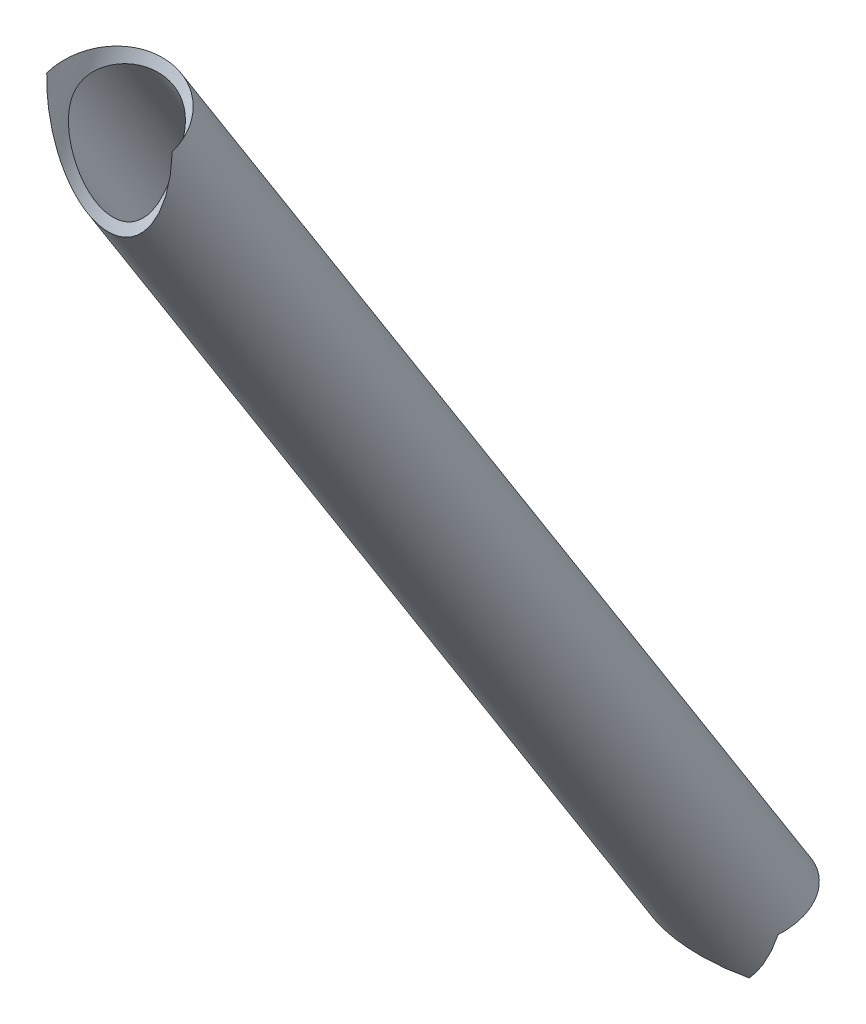
ISO-10303-21;
HEADER;
FILE_DESCRIPTION(('STEP AP214'),'2;1');
FILE_NAME('part.step','',(''),(''),'','','');
FILE_SCHEMA(('AUTOMOTIVE_DESIGN { 1 0 10303 214 1 1 1 1 }'));
ENDSEC;
DATA;
#1=APPLICATION_CONTEXT('core data for automotive mechanical design processes');
#2=APPLICATION_PROTOCOL_DEFINITION('international standard','automotive_design',2000,#1);
#3=PRODUCT_CONTEXT('',#1,'mechanical');
#4=PRODUCT('Part','Part','',(#3));
#5=PRODUCT_RELATED_PRODUCT_CATEGORY('part','',(#4));
#6=PRODUCT_DEFINITION_FORMATION('','',#4);
#7=PRODUCT_DEFINITION_CONTEXT('part definition',#1,'design');
#8=PRODUCT_DEFINITION('design','',#6,#7);
#9=PRODUCT_DEFINITION_SHAPE('','',#8);
#10=(LENGTH_UNIT() NAMED_UNIT(*) SI_UNIT(.MILLI.,.METRE.));
#11=(NAMED_UNIT(*) PLANE_ANGLE_UNIT() SI_UNIT($,.RADIAN.));
#12=(NAMED_UNIT(*) SI_UNIT($,.STERADIAN.) SOLID_ANGLE_UNIT());
#13=UNCERTAINTY_MEASURE_WITH_UNIT(LENGTH_MEASURE(1.E-05),#10,'distance_accuracy_value','');
#14=(GEOMETRIC_REPRESENTATION_CONTEXT(3) GLOBAL_UNCERTAINTY_ASSIGNED_CONTEXT((#13)) GLOBAL_UNIT_ASSIGNED_CONTEXT((#10,
#11,#12)) REPRESENTATION_CONTEXT('',''));
#15=CARTESIAN_POINT('',(0.,0.,0.));
#16=DIRECTION('',(0.,0.,1.));
#17=DIRECTION('',(1.,0.,0.));
#18=AXIS2_PLACEMENT_3D('',#15,#16,#17);
#19=CARTESIAN_POINT('',(-182.5,460.,-1823.25662851832));
#20=DIRECTION('',(-0.220873286514699,-0.785327240941153,-0.578339101168122));
#21=DIRECTION('',(0.,0.59298432397081,-0.805214003557365));
#22=AXIS2_PLACEMENT_3D('',#19,#20,#21);
#23=CYLINDRICAL_SURFACE('',#22,7.90000000000002);
#24=CARTESIAN_POINT('',(-183.782929385817,460.123049454243,-1832.97706751712));
#25=CARTESIAN_POINT('',(-183.996365418633,460.161990899168,-1832.94839102335));
#26=CARTESIAN_POINT('',(-184.209272187102,460.1973646617,-1832.91103886583));
#27=CARTESIAN_POINT('',(-184.63250458258,460.260677591489,-1832.81930829964));
#28=CARTESIAN_POINT('',(-184.84283031414,460.288617060845,-1832.76493058301));
#29=CARTESIAN_POINT('',(-185.259328701157,460.336713169078,-1832.63971389232));
#30=CARTESIAN_POINT('',(-185.465503080251,460.356873103915,-1832.56888190988));
#31=CARTESIAN_POINT('',(-185.872410916979,460.389051895739,-1832.41148382624));
#32=CARTESIAN_POINT('',(-186.073144253838,460.401070572155,-1832.32491737612));
#33=CARTESIAN_POINT('',(-186.467634409103,460.416529661797,-1832.1371043889));
#34=CARTESIAN_POINT('',(-186.661400034826,460.419981308561,-1832.03587726027));
#35=CARTESIAN_POINT('',(-187.041097087739,460.417844366256,-1831.81975706826));
#36=CARTESIAN_POINT('',(-187.227028503393,460.412255763877,-1831.70486398475));
#37=CARTESIAN_POINT('',(-187.590197059073,460.391436943553,-1831.46258378557));
#38=CARTESIAN_POINT('',(-187.767427576767,460.37619950072,-1831.33518736807));
#39=CARTESIAN_POINT('',(-188.112185260695,460.335344299925,-1831.06940710276));
#40=CARTESIAN_POINT('',(-188.279712429764,460.309726544997,-1830.93102325817));
#41=CARTESIAN_POINT('',(-188.608031838652,460.246483565966,-1830.64163372152));
#42=CARTESIAN_POINT('',(-188.768584439725,460.208598647269,-1830.4904126311));
#43=CARTESIAN_POINT('',(-189.078160509209,460.119769031618,-1830.18014023262));
#44=CARTESIAN_POINT('',(-189.227182272952,460.068822408462,-1830.02108777245));
#45=CARTESIAN_POINT('',(-189.51301941778,459.952372327207,-1829.69766317833));
#46=CARTESIAN_POINT('',(-189.649844586469,459.886880691374,-1829.53329545682));
#47=CARTESIAN_POINT('',(-189.91094366784,459.739453462103,-1829.20201164457));
#48=CARTESIAN_POINT('',(-190.035222881636,459.657524857955,-1829.03509666474));
#49=CARTESIAN_POINT('',(-190.235488878639,459.502526814562,-1828.75227479338));
#50=CARTESIAN_POINT('',(-190.314772747803,459.434181652207,-1828.63609813315));
#51=CARTESIAN_POINT('',(-190.46691574068,459.287712995913,-1828.40573697454));
#52=CARTESIAN_POINT('',(-190.539776738315,459.20959237024,-1828.29155190294));
#53=CARTESIAN_POINT('',(-190.678863595887,459.043146253857,-1828.06705747249));
#54=CARTESIAN_POINT('',(-190.745102928139,458.954842304722,-1827.95674055343));
#55=CARTESIAN_POINT('',(-190.871081784257,458.76757296722,-1827.74154584695));
#56=CARTESIAN_POINT('',(-190.930821388589,458.668607710871,-1827.63666799219));
#57=CARTESIAN_POINT('',(-191.04428169902,458.459282606375,-1827.43337386971));
#58=CARTESIAN_POINT('',(-191.097951588304,458.348839568837,-1827.33501465678));
#59=CARTESIAN_POINT('',(-191.198876639956,458.117833817087,-1827.14730893173));
#60=CARTESIAN_POINT('',(-191.246132179904,457.997271699211,-1827.05796188919));
#61=CARTESIAN_POINT('',(-191.334541302837,457.747092842233,-1826.88940153969));
#62=CARTESIAN_POINT('',(-191.375692320616,457.617472330134,-1826.81019249477));
#63=CARTESIAN_POINT('',(-191.452290347638,457.350681327526,-1826.66247251175));
#64=CARTESIAN_POINT('',(-191.487736508228,457.213509717785,-1826.59396316537));
#65=CARTESIAN_POINT('',(-191.560667329263,456.902275812859,-1826.45361717447));
#66=CARTESIAN_POINT('',(-191.596878906324,456.726747001097,-1826.38437616344));
#67=CARTESIAN_POINT('',(-191.662500721917,456.369388158518,-1826.26055538306));
#68=CARTESIAN_POINT('',(-191.691908596894,456.187555963101,-1826.20598070763));
#69=CARTESIAN_POINT('',(-191.744855168915,455.81917194836,-1826.10964454093));
#70=CARTESIAN_POINT('',(-191.768376454908,455.632607884606,-1826.06792097797));
#71=CARTESIAN_POINT('',(-191.81016039748,455.256707012275,-1825.99562766363));
#72=CARTESIAN_POINT('',(-191.82842057815,455.067368942133,-1825.96506316196));
#73=CARTESIAN_POINT('',(-191.860515322095,454.683419996998,-1825.91288315487));
#74=CARTESIAN_POINT('',(-191.874258858325,454.488777421397,-1825.89144940218));
#75=CARTESIAN_POINT('',(-191.89724564479,454.098549105152,-1825.85679727534));
#76=CARTESIAN_POINT('',(-191.906489495314,453.902963493833,-1825.84357780528));
#77=CARTESIAN_POINT('',(-191.920765086356,453.511109416442,-1825.8240111242));
#78=CARTESIAN_POINT('',(-191.925792519484,453.314840457249,-1825.81767093896));
#79=CARTESIAN_POINT('',(-191.931788487606,452.92212991396,-1825.81080619898));
#80=CARTESIAN_POINT('',(-191.932756517874,452.725688311436,-1825.8102823674));
#81=CARTESIAN_POINT('',(-191.929714278285,452.135518773482,-1825.81607725823));
#82=CARTESIAN_POINT('',(-191.919724835952,451.741878969849,-1825.82979983034));
#83=CARTESIAN_POINT('',(-191.883804625779,450.95636052234,-1825.87168328823));
#84=CARTESIAN_POINT('',(-191.857881649469,450.564481111917,-1825.89983711597));
#85=CARTESIAN_POINT('',(-191.803082025541,449.940649168108,-1825.95360576877));
#86=CARTESIAN_POINT('',(-191.779606981911,449.707898364895,-1825.97567040522));
#87=CARTESIAN_POINT('',(-191.72637645465,449.243467846358,-1826.0232056825));
#88=CARTESIAN_POINT('',(-191.69662120109,449.011788092114,-1826.04867619855));
#89=CARTESIAN_POINT('',(-191.630437911049,448.549587436997,-1826.10259880167));
#90=CARTESIAN_POINT('',(-191.594005890027,448.319067313019,-1826.13105266478));
#91=CARTESIAN_POINT('',(-191.514015858885,447.859621190329,-1826.19057151969));
#92=CARTESIAN_POINT('',(-191.470458453651,447.630695058018,-1826.22163628974));
#93=CARTESIAN_POINT('',(-191.375684030791,447.17495592242,-1826.28605628983));
#94=CARTESIAN_POINT('',(-191.324473480758,446.94814130501,-1826.31940957312));
#95=CARTESIAN_POINT('',(-191.213681494519,446.496899402838,-1826.38817633366));
#96=CARTESIAN_POINT('',(-191.154101023843,446.272471845919,-1826.423589573));
#97=CARTESIAN_POINT('',(-191.025777630583,445.82671546748,-1826.49623499982));
#98=CARTESIAN_POINT('',(-190.957041437701,445.605384500677,-1826.5334658387));
#99=CARTESIAN_POINT('',(-190.809382848364,445.166460329949,-1826.60956204035));
#100=CARTESIAN_POINT('',(-190.730462237223,444.948866478471,-1826.64842711583));
#101=CARTESIAN_POINT('',(-190.549508758486,444.488603589777,-1826.73307837491));
#102=CARTESIAN_POINT('',(-190.445788933985,444.246629581565,-1826.77907826701));
#103=CARTESIAN_POINT('',(-190.221369174988,443.770796663451,-1826.87264222649));
#104=CARTESIAN_POINT('',(-190.100662617424,443.5369409634,-1826.92020689838));
#105=CARTESIAN_POINT('',(-189.840366259747,443.08170355493,-1827.01621808229));
#106=CARTESIAN_POINT('',(-189.700877484296,442.860263520812,-1827.06465875209));
#107=CARTESIAN_POINT('',(-189.399753326948,442.433275608713,-1827.16201131562));
#108=CARTESIAN_POINT('',(-189.238147637012,442.227706992508,-1827.21092249719));
#109=CARTESIAN_POINT('',(-188.903634444973,441.854201537265,-1827.30446171487));
#110=CARTESIAN_POINT('',(-188.732646759143,441.684572225836,-1827.34912113639));
#111=CARTESIAN_POINT('',(-188.367617694173,441.371117529906,-1827.43699879182));
#112=CARTESIAN_POINT('',(-188.173581942077,441.227285868503,-1827.48021737422));
#113=CARTESIAN_POINT('',(-187.864857253716,441.036828170591,-1827.5429430865));
#114=CARTESIAN_POINT('',(-187.758287413039,440.97726856464,-1827.56362274616));
#115=CARTESIAN_POINT('',(-187.539977870367,440.868156283187,-1827.60393790794));
#116=CARTESIAN_POINT('',(-187.428240906707,440.818598380284,-1827.62357395154));
#117=CARTESIAN_POINT('',(-187.200396368974,440.730525715298,-1827.66153901189));
#118=CARTESIAN_POINT('',(-187.08429305142,440.692000498368,-1827.67986925359));
#119=CARTESIAN_POINT('',(-186.848608759389,440.626682406464,-1827.7150104967));
#120=CARTESIAN_POINT('',(-186.729028191112,440.599888166948,-1827.73182167463));
#121=CARTESIAN_POINT('',(-186.501022851049,440.560726722567,-1827.76195906776));
#122=CARTESIAN_POINT('',(-186.392839139211,440.54708495673,-1827.7754648847));
#123=CARTESIAN_POINT('',(-186.175511988716,440.529339509361,-1827.80104669038));
#124=CARTESIAN_POINT('',(-186.066368255596,440.525238864575,-1827.81312222273));
#125=CARTESIAN_POINT('',(-185.738756402876,440.526942028357,-1827.8471289129));
#126=CARTESIAN_POINT('',(-185.520028938731,440.54673785209,-1827.86685048892));
#127=CARTESIAN_POINT('',(-185.029873003187,440.629173438911,-1827.90505184519));
#128=CARTESIAN_POINT('',(-184.760076133364,440.7018962687,-1827.92177400715));
#129=CARTESIAN_POINT('',(-184.234895722107,440.888997728722,-1827.94740464497));
#130=CARTESIAN_POINT('',(-183.979545026595,441.003467201281,-1827.95629593535));
#131=CARTESIAN_POINT('',(-183.533008891036,441.238592911495,-1827.96681060061));
#132=CARTESIAN_POINT('',(-183.338918957374,441.353838547954,-1827.9695018726));
#133=CARTESIAN_POINT('',(-182.961247560706,441.600595070759,-1827.97168101293));
#134=CARTESIAN_POINT('',(-182.777673139667,441.732116674641,-1827.97116675935));
#135=CARTESIAN_POINT('',(-182.420440194355,442.008249179628,-1827.96762128471));
#136=CARTESIAN_POINT('',(-182.246793069924,442.152874654747,-1827.96458722977));
#137=CARTESIAN_POINT('',(-181.908860117363,442.452694143299,-1827.95658150396));
#138=CARTESIAN_POINT('',(-181.744577935388,442.607892222152,-1827.95160908423));
#139=CARTESIAN_POINT('',(-181.428877956133,442.92281939205,-1827.94037027854));
#140=CARTESIAN_POINT('',(-181.27723739933,443.082327671896,-1827.93414066154));
#141=CARTESIAN_POINT('',(-180.981655909013,443.408221356909,-1827.92071403444));
#142=CARTESIAN_POINT('',(-180.837713911005,443.574605805626,-1827.91351715858));
#143=CARTESIAN_POINT('',(-180.556838331671,443.913410365732,-1827.89850736617));
#144=CARTESIAN_POINT('',(-180.41991145561,444.085835995894,-1827.89069387772));
#145=CARTESIAN_POINT('',(-180.152742867497,444.435789902509,-1827.87479258857));
#146=CARTESIAN_POINT('',(-180.022501939748,444.61331877381,-1827.86670475586));
#147=CARTESIAN_POINT('',(-179.639770566991,445.154607579991,-1827.8424255025));
#148=CARTESIAN_POINT('',(-179.396833731415,445.525159444688,-1827.82630961153));
#149=CARTESIAN_POINT('',(-178.934209394315,446.280213943386,-1827.79700260672));
#150=CARTESIAN_POINT('',(-178.714508166788,446.664708158874,-1827.78380976103));
#151=CARTESIAN_POINT('',(-178.387167485926,447.276833637118,-1827.76793225655));
#152=CARTESIAN_POINT('',(-178.27211572574,447.500480932657,-1827.76317012668));
#153=CARTESIAN_POINT('',(-178.049008416853,447.951298294016,-1827.75636137253));
#154=CARTESIAN_POINT('',(-177.940953101891,448.178468477216,-1827.75431483892));
#155=CARTESIAN_POINT('',(-177.73176665356,448.636395578598,-1827.75380997228));
#156=CARTESIAN_POINT('',(-177.630646191575,448.86715738257,-1827.75535704696));
#157=CARTESIAN_POINT('',(-177.435773782143,449.331691385699,-1827.76313971301));
#158=CARTESIAN_POINT('',(-177.342021453464,449.565463428375,-1827.76937506162));
#159=CARTESIAN_POINT('',(-177.163124297587,450.033836220418,-1827.78782881145));
#160=CARTESIAN_POINT('',(-177.077914452033,450.268413963787,-1827.79999709382));
#161=CARTESIAN_POINT('',(-176.916010227104,450.740069474307,-1827.83200175079));
#162=CARTESIAN_POINT('',(-176.839317881941,450.977147823931,-1827.85183995214));
#163=CARTESIAN_POINT('',(-176.695918169295,451.452652121512,-1827.90128796219));
#164=CARTESIAN_POINT('',(-176.629185037832,451.691072876238,-1827.93087189935));
#165=CARTESIAN_POINT('',(-176.507366427327,452.168949706124,-1828.00250298263));
#166=CARTESIAN_POINT('',(-176.452272709787,452.408404925744,-1828.04454126247));
#167=CARTESIAN_POINT('',(-176.371623733165,452.811071209339,-1828.1284488781));
#168=CARTESIAN_POINT('',(-176.342241650131,452.974381283582,-1828.16614466141));
#169=CARTESIAN_POINT('',(-176.291295852315,453.300129942158,-1828.24991328461));
#170=CARTESIAN_POINT('',(-176.269732742525,453.462568458097,-1828.29598677232));
#171=CARTESIAN_POINT('',(-176.235798598135,453.785048751397,-1828.39732687121));
#172=CARTESIAN_POINT('',(-176.223401190341,453.945096096731,-1828.45256654176));
#173=CARTESIAN_POINT('',(-176.209123775802,454.261903034508,-1828.57298902063));
#174=CARTESIAN_POINT('',(-176.207241193875,454.418663422588,-1828.63816939035));
#175=CARTESIAN_POINT('',(-176.214708627383,454.703320067162,-1828.76764701054));
#176=CARTESIAN_POINT('',(-176.222357914585,454.831914973835,-1828.83050627194));
#177=CARTESIAN_POINT('',(-176.246769487825,455.084664973305,-1828.96301914967));
#178=CARTESIAN_POINT('',(-176.263530795308,455.208820541323,-1829.03267203577));
#179=CARTESIAN_POINT('',(-176.306589459862,455.451897164227,-1829.17805180661));
#180=CARTESIAN_POINT('',(-176.332891706523,455.570815500004,-1829.25378179023));
#181=CARTESIAN_POINT('',(-176.395152969684,455.802727889835,-1829.41018400136));
#182=CARTESIAN_POINT('',(-176.431112573999,455.915721582773,-1829.49085652946));
#183=CARTESIAN_POINT('',(-176.512340361915,456.134932912357,-1829.65543665578));
#184=CARTESIAN_POINT('',(-176.557564039186,456.241179877726,-1829.73932728297));
#185=CARTESIAN_POINT('',(-176.657060099016,456.447442794844,-1829.90934004329));
#186=CARTESIAN_POINT('',(-176.711332400523,456.547458802397,-1829.99546215642));
#187=CARTESIAN_POINT('',(-176.828505347403,456.741571819219,-1830.16873471487));
#188=CARTESIAN_POINT('',(-176.891415367566,456.835662233159,-1830.25588618215));
#189=CARTESIAN_POINT('',(-177.025286304093,457.018173971961,-1830.42996128264));
#190=CARTESIAN_POINT('',(-177.096249217948,457.106593881725,-1830.51688485383));
#191=CARTESIAN_POINT('',(-177.278947429161,457.316382129352,-1830.72787572282));
#192=CARTESIAN_POINT('',(-177.39477188362,457.434898827963,-1830.8512551256));
#193=CARTESIAN_POINT('',(-177.640537446075,457.662293158064,-1831.09275077248));
#194=CARTESIAN_POINT('',(-177.770483640455,457.771167290687,-1831.21086509844));
#195=CARTESIAN_POINT('',(-178.043167383346,457.980524398562,-1831.43982575752));
#196=CARTESIAN_POINT('',(-178.185915735289,458.081000145839,-1831.55066581284));
#197=CARTESIAN_POINT('',(-178.482816930831,458.274423258273,-1831.7632727371));
#198=CARTESIAN_POINT('',(-178.6369706034,458.367370075177,-1831.86503894534));
#199=CARTESIAN_POINT('',(-178.95776044902,458.54775363989,-1832.0594710548));
#200=CARTESIAN_POINT('',(-179.124544680515,458.635091488277,-1832.15198439648));
#201=CARTESIAN_POINT('',(-179.467362162739,458.803304680664,-1832.32495970976));
#202=CARTESIAN_POINT('',(-179.643395394025,458.884180038247,-1832.4054217067));
#203=CARTESIAN_POINT('',(-180.003481668367,459.03981446081,-1832.55322656646));
#204=CARTESIAN_POINT('',(-180.187534240059,459.114573884533,-1832.62057019911));
#205=CARTESIAN_POINT('',(-180.562416326747,459.258171623125,-1832.74124483337));
#206=CARTESIAN_POINT('',(-180.753245971846,459.327009824234,-1832.79457556581));
#207=CARTESIAN_POINT('',(-181.173827712509,459.470214070729,-1832.89441315022));
#208=CARTESIAN_POINT('',(-181.404616169386,459.543485717737,-1832.93815653498));
#209=CARTESIAN_POINT('',(-181.871636934894,459.681927971231,-1833.00444513502));
#210=CARTESIAN_POINT('',(-182.107870039435,459.747097384296,-1833.02698723066));
#211=CARTESIAN_POINT('',(-182.583555967879,459.869126375506,-1833.05028846152));
#212=CARTESIAN_POINT('',(-182.823008978309,459.925985469957,-1833.05104632931));
#213=CARTESIAN_POINT('',(-183.302840405206,460.031078795832,-1833.03053769921));
#214=CARTESIAN_POINT('',(-183.543218692167,460.079314192434,-1833.00927417933));
#215=CARTESIAN_POINT('',(-183.782929385817,460.123049454243,-1832.97706751712));
#216=B_SPLINE_CURVE_WITH_KNOTS('',3,(#24,#25,#26,#27,#28,#29,#30,#31,#32,#33,#34,#35,#36,#37,
#38,#39,#40,#41,#42,#43,#44,#45,#46,#47,#48,#49,#50,#51,#52,#53,#54,#55,#56,#57,#58,#59,#60,#61,
#62,#63,#64,#65,#66,#67,#68,#69,#70,#71,#72,#73,#74,#75,#76,#77,#78,#79,#80,#81,#82,#83,#84,#85,
#86,#87,#88,#89,#90,#91,#92,#93,#94,#95,#96,#97,#98,#99,#100,#101,#102,#103,#104,#105,#106,#107,
#108,#109,#110,#111,#112,#113,#114,#115,#116,#117,#118,#119,#120,#121,#122,#123,#124,#125,#126,
#127,#128,#129,#130,#131,#132,#133,#134,#135,#136,#137,#138,#139,#140,#141,#142,#143,#144,#145,
#146,#147,#148,#149,#150,#151,#152,#153,#154,#155,#156,#157,#158,#159,#160,#161,#162,#163,#164,
#165,#166,#167,#168,#169,#170,#171,#172,#173,#174,#175,#176,#177,#178,#179,#180,#181,#182,#183,
#184,#185,#186,#187,#188,#189,#190,#191,#192,#193,#194,#195,#196,#197,#198,#199,#200,#201,#202,
#203,#204,#205,#206,#207,#208,#209,#210,#211,#212,#213,#214,#215),.UNSPECIFIED.,.T.,.F.,(4,2,2,
2,2,2,2,2,2,2,2,2,2,2,2,2,2,2,2,2,2,2,2,2,2,2,2,2,2,2,2,2,2,2,2,2,2,2,2,2,2,2,2,2,2,2,2,2,2,2,2,
2,2,2,2,2,2,2,2,2,2,2,2,2,2,2,2,2,2,2,2,2,2,2,2,2,2,2,2,2,2,2,2,2,2,2,2,2,2,2,2,2,2,2,2,4),(0.,
0.656313769586974,1.31260086529284,1.96860960548502,2.62463289525494,3.27979551748547,
3.93495910441931,4.59061384783999,5.24626839973016,5.91682599816314,6.58748254019905,
7.25759595100446,7.92742501934324,8.39616493900115,8.86476764444605,9.33239665872823,
9.80001988316026,10.2713063640329,10.7425650906698,11.2140212892852,11.6855475568476,
12.2610166196273,12.8366852968456,13.4140370522362,13.9916600708172,14.5802972252748,
15.1688558298372,15.7580149618001,16.3472473447539,17.5285090094089,18.7091934937912,
19.4140052082329,20.118791106829,20.8239989832706,21.5291470245301,22.2337024875266,
22.9381767416945,23.642136016641,24.3459720556962,25.1471693331613,25.9486798646267,
26.7460397411548,27.5423394749314,28.2753348037673,29.0081515426737,29.3791870745115,
29.750028179123,30.1205166937419,30.4909621018266,30.8201440633221,31.149430782465,
31.8077662435099,32.6429995610126,33.4800613304448,34.1563581735425,34.8331027439715,
35.5106094462068,36.1883781527292,36.8486277429158,37.5087858019709,38.1695635177375,
38.8304185704851,40.1595192935377,41.4878304373746,42.242364850268,42.9969244580424,
43.7526202758289,44.5082769676196,45.2576579908959,46.0072176037166,46.7548032179127,
47.5018578972054,48.0120194426441,48.522220453257,49.0309476472703,49.5395502436515,
49.9690851683993,50.398573973854,50.8282831976707,51.2580185825821,51.6857359191948,
52.1134494247718,52.5416308658202,52.9699187488438,53.588835338492,54.2079755937048,
54.8276433330878,55.4473561558898,56.0760141035272,56.7046707296267,57.333290453901,
57.961922252549,58.6989787106491,59.4361436053056,60.1733513888613,60.9104594904501),.UNSPECIFIED.);
#217=CARTESIAN_POINT('',(-183.782929385817,460.123049454243,-1832.97706751712));
#218=VERTEX_POINT('',#217);
#219=EDGE_CURVE('E91',#218,#218,#216,.T.);
#220=ORIENTED_EDGE('',*,*,#219,.T.);
#221=EDGE_LOOP('',(#220));
#222=FACE_BOUND('',#221,.T.);
#223=CARTESIAN_POINT('',(-247.1875,230.,-1992.63569285493));
#224=DIRECTION('',(0.,-1.,0.));
#225=DIRECTION('',(-0.356776144958629,0.,-0.934189907025579));
#226=AXIS2_PLACEMENT_3D('',#223,#224,#225);
#227=ELLIPSE('',#226,10.0595007891646,7.90000000000002);
#228=CARTESIAN_POINT('',(-255.361082505996,230.,-1995.07106715428));
#229=VERTEX_POINT('',#228);
#230=CARTESIAN_POINT('',(-239.031263409849,230.,-1990.));
#231=VERTEX_POINT('',#230);
#232=EDGE_CURVE('E57',#229,#231,#227,.T.);
#233=ORIENTED_EDGE('',*,*,#232,.T.);
#234=CARTESIAN_POINT('',(-246.180903451477,233.579009950304,-1990.));
#235=DIRECTION('',(0.,0.,-1.));
#236=DIRECTION('',(-0.270745576918284,-0.962650940153899,0.));
#237=AXIS2_PLACEMENT_3D('',#234,#235,#236);
#238=ELLIPSE('',#237,13.6598061311153,7.90000000000002);
#239=CARTESIAN_POINT('',(-242.333239024515,223.956928650387,-1990.));
#240=VERTEX_POINT('',#239);
#241=EDGE_CURVE('E84',#231,#240,#238,.T.);
#242=ORIENTED_EDGE('',*,*,#241,.T.);
#243=CARTESIAN_POINT('',(-248.802098740882,228.943780636233,-2003.22458163198));
#244=CARTESIAN_POINT('',(-248.584938313846,228.916197732314,-2003.24489309986));
#245=CARTESIAN_POINT('',(-248.367753507514,228.882967653673,-2003.2580093854));
#246=CARTESIAN_POINT('',(-247.93502325747,228.80472456298,-2003.27024637239));
#247=CARTESIAN_POINT('',(-247.719478834988,228.759704744526,-2003.26935897171));
#248=CARTESIAN_POINT('',(-247.291296431889,228.657548333584,-2003.25392756282));
#249=CARTESIAN_POINT('',(-247.078665305796,228.600387120844,-2003.23935559654));
#250=CARTESIAN_POINT('',(-246.658379493778,228.474001700257,-2003.19687479696));
#251=CARTESIAN_POINT('',(-246.450724788091,228.404777540327,-2003.16896601662));
#252=CARTESIAN_POINT('',(-246.042011189916,228.254509469702,-2003.10019034036));
#253=CARTESIAN_POINT('',(-245.840950310858,228.173469159772,-2003.05932738757));
#254=CARTESIAN_POINT('',(-245.446847972706,227.999984525041,-2002.96502445407));
#255=CARTESIAN_POINT('',(-245.253806815308,227.907539771732,-2002.91158400073));
#256=CARTESIAN_POINT('',(-244.877279216058,227.711948645539,-2002.79257063855));
#257=CARTESIAN_POINT('',(-244.693786913983,227.60880895539,-2002.72700528614));
#258=CARTESIAN_POINT('',(-244.337529706974,227.39261273798,-2002.58414334031));
#259=CARTESIAN_POINT('',(-244.164764645583,227.27955635541,-2002.50684691805));
#260=CARTESIAN_POINT('',(-243.832538315807,227.045530769477,-2002.34164957035));
#261=CARTESIAN_POINT('',(-243.672977187217,226.924636293023,-2002.25384351878));
#262=CARTESIAN_POINT('',(-243.366554951528,226.67524874601,-2002.06752116855));
#263=CARTESIAN_POINT('',(-243.219693841129,226.546755677424,-2001.96900487268));
#264=CARTESIAN_POINT('',(-242.939477260112,226.283441628028,-2001.76159421168));
#265=CARTESIAN_POINT('',(-242.806126815669,226.148618319369,-2001.65269601334));
#266=CARTESIAN_POINT('',(-242.553701000389,225.874176483618,-2001.42486433179));
#267=CARTESIAN_POINT('',(-242.434625651452,225.734557949171,-2001.30593083318));
#268=CARTESIAN_POINT('',(-242.209719187486,225.450189120742,-2001.05649279681));
#269=CARTESIAN_POINT('',(-242.104100213985,225.305394104033,-2000.92584790097));
#270=CARTESIAN_POINT('',(-241.908535099713,225.014548414331,-2000.65457048542));
#271=CARTESIAN_POINT('',(-241.818590217634,224.868497641482,-2000.51393716488));
#272=CARTESIAN_POINT('',(-241.654652157057,224.577419705982,-2000.22267077481));
#273=CARTESIAN_POINT('',(-241.580658510707,224.43239251343,-2000.07203799873));
#274=CARTESIAN_POINT('',(-241.448731430654,224.14601249996,-1999.76060910505));
#275=CARTESIAN_POINT('',(-241.39079442342,224.00465886782,-1999.59981525867));
#276=CARTESIAN_POINT('',(-241.301227108753,223.757364776383,-1999.30220054116));
#277=CARTESIAN_POINT('',(-241.266633264685,223.650156599834,-1999.16731807711));
#278=CARTESIAN_POINT('',(-241.207301275054,223.441855294086,-1998.8908384734));
#279=CARTESIAN_POINT('',(-241.182561169795,223.340760952373,-1998.74924267514));
#280=CARTESIAN_POINT('',(-241.142668770807,223.146907254581,-1998.45948078044));
#281=CARTESIAN_POINT('',(-241.127500642452,223.054134351914,-1998.31132597126));
#282=CARTESIAN_POINT('',(-241.106217389868,222.879022076792,-1998.0083367319));
#283=CARTESIAN_POINT('',(-241.100100583441,222.796680768215,-1997.8535035484));
#284=CARTESIAN_POINT('',(-241.096512730862,222.656565550561,-1997.56212697383));
#285=CARTESIAN_POINT('',(-241.097846548835,222.596962235697,-1997.42647734817));
#286=CARTESIAN_POINT('',(-241.105896966583,222.488169717538,-1997.15122910232));
#287=CARTESIAN_POINT('',(-241.112612492609,222.438978439327,-1997.01163127523));
#288=CARTESIAN_POINT('',(-241.130730260546,222.352076485774,-1996.72932328266));
#289=CARTESIAN_POINT('',(-241.142128641886,222.314356397993,-1996.58661577237));
#290=CARTESIAN_POINT('',(-241.168840460458,222.250960112413,-1996.29890869112));
#291=CARTESIAN_POINT('',(-241.184153984558,222.225284181876,-1996.15390906936));
#292=CARTESIAN_POINT('',(-241.217856107649,222.186139616094,-1995.86306781739));
#293=CARTESIAN_POINT('',(-241.236235748825,222.172636133705,-1995.71722980137));
#294=CARTESIAN_POINT('',(-241.275369374003,222.157315764048,-1995.42527757695));
#295=CARTESIAN_POINT('',(-241.296123395787,222.15549906277,-1995.27916336417));
#296=CARTESIAN_POINT('',(-241.339403624062,222.162771168017,-1994.98735467387));
#297=CARTESIAN_POINT('',(-241.361931439055,222.171869981839,-1994.84166070444));
#298=CARTESIAN_POINT('',(-241.40826742356,222.199968939566,-1994.55141774562));
#299=CARTESIAN_POINT('',(-241.4320760325,222.218972501373,-1994.40686916896));
#300=CARTESIAN_POINT('',(-241.500002267189,222.284465110219,-1994.00451597309));
#301=CARTESIAN_POINT('',(-241.545151636072,222.340783861446,-1993.74847133213));
#302=CARTESIAN_POINT('',(-241.637330395573,222.475693909284,-1993.24265265673));
#303=CARTESIAN_POINT('',(-241.684361440275,222.55430518874,-1992.99288446813));
#304=CARTESIAN_POINT('',(-241.780211999972,222.729128139965,-1992.49874034589));
#305=CARTESIAN_POINT('',(-241.82903848515,222.82541587224,-1992.25439303687));
#306=CARTESIAN_POINT('',(-241.928379365561,223.031496624796,-1991.7719742873));
#307=CARTESIAN_POINT('',(-241.978893260514,223.14128566767,-1991.53390102343));
#308=CARTESIAN_POINT('',(-242.089651485682,223.388842271426,-1991.0282424464));
#309=CARTESIAN_POINT('',(-242.150219923943,223.528337364405,-1990.76157842642));
#310=CARTESIAN_POINT('',(-242.274624003948,223.818508431031,-1990.235145815));
#311=CARTESIAN_POINT('',(-242.338460419749,223.969187057462,-1989.97537887954));
#312=CARTESIAN_POINT('',(-242.470114241801,224.279772665153,-1989.46205804654));
#313=CARTESIAN_POINT('',(-242.537936006287,224.439689745908,-1989.20851139734));
#314=CARTESIAN_POINT('',(-242.678172714823,224.767089879511,-1988.70768919102));
#315=CARTESIAN_POINT('',(-242.750587312202,224.934572361042,-1988.46041316256));
#316=CARTESIAN_POINT('',(-242.900751302659,225.276087262174,-1987.97197682017));
#317=CARTESIAN_POINT('',(-242.978502157147,225.45012147012,-1987.73081820655));
#318=CARTESIAN_POINT('',(-243.14008987039,225.803907881834,-1987.25481921183));
#319=CARTESIAN_POINT('',(-243.223926644916,225.983660006446,-1987.01997874335));
#320=CARTESIAN_POINT('',(-243.398456578094,226.348127361502,-1986.55716752801));
#321=CARTESIAN_POINT('',(-243.489143171423,226.532837732842,-1986.32919048874));
#322=CARTESIAN_POINT('',(-243.678406768881,226.906926936143,-1985.88046024571));
#323=CARTESIAN_POINT('',(-243.776983456978,227.09630558091,-1985.65970675311));
#324=CARTESIAN_POINT('',(-243.994678519208,227.500769835809,-1985.20206349494));
#325=CARTESIAN_POINT('',(-244.114861502462,227.716364431175,-1984.96612487766));
#326=CARTESIAN_POINT('',(-244.368235317453,228.152357792492,-1984.50603534444));
#327=CARTESIAN_POINT('',(-244.501422464434,228.372755183889,-1984.28188111691));
#328=CARTESIAN_POINT('',(-244.78272422142,228.817112621725,-1983.84863897563));
#329=CARTESIAN_POINT('',(-244.930786167048,229.041057888533,-1983.6395021102));
#330=CARTESIAN_POINT('',(-245.245099340076,229.49227824992,-1983.23946796674));
#331=CARTESIAN_POINT('',(-245.411335731329,229.719550499269,-1983.04855604633));
#332=CARTESIAN_POINT('',(-245.751035565719,230.156969458488,-1982.70574257102));
#333=CARTESIAN_POINT('',(-245.922730727495,230.366958107084,-1982.55191356465));
#334=CARTESIAN_POINT('',(-246.288320619194,230.786506327625,-1982.27139881605));
#335=CARTESIAN_POINT('',(-246.482222326731,230.996065743529,-1982.14472164142));
#336=CARTESIAN_POINT('',(-246.864984952975,231.379411474008,-1981.94527145647));
#337=CARTESIAN_POINT('',(-247.05035394073,231.553906656311,-1981.86729827315));
#338=CARTESIAN_POINT('',(-247.440470097573,231.893708390657,-1981.74832571352));
#339=CARTESIAN_POINT('',(-247.645171201316,232.05903536675,-1981.70724077826));
#340=CARTESIAN_POINT('',(-248.017803970734,232.332877864575,-1981.67660207419));
#341=CARTESIAN_POINT('',(-248.18202424332,232.445219742764,-1981.67668175911));
#342=CARTESIAN_POINT('',(-248.516675778056,232.655824917593,-1981.70654520107));
#343=CARTESIAN_POINT('',(-248.687100614618,232.754102287175,-1981.73629902516));
#344=CARTESIAN_POINT('',(-249.029770183529,232.933005248644,-1981.82636981268));
#345=CARTESIAN_POINT('',(-249.202018496271,233.013584267253,-1981.88676606307));
#346=CARTESIAN_POINT('',(-249.542575479352,233.154746617747,-1982.0355613128));
#347=CARTESIAN_POINT('',(-249.710880921879,233.215314064546,-1982.12398244959));
#348=CARTESIAN_POINT('',(-250.077706257654,233.328505698858,-1982.34727006649));
#349=CARTESIAN_POINT('',(-250.274112508611,233.375978610158,-1982.4881597949));
#350=CARTESIAN_POINT('',(-250.651092276681,233.444729110159,-1982.79522413281));
#351=CARTESIAN_POINT('',(-250.831632557234,233.465952871815,-1982.96144991599));
#352=CARTESIAN_POINT('',(-251.14189765481,233.484930167844,-1983.27611630738));
#353=CARTESIAN_POINT('',(-251.27458010746,233.486517403912,-1983.42150182523));
#354=CARTESIAN_POINT('',(-251.530114634271,233.478272057442,-1983.72045421972));
#355=CARTESIAN_POINT('',(-251.652960216852,233.468431999086,-1983.87402638938));
#356=CARTESIAN_POINT('',(-251.889684262902,233.439227159762,-1984.18737260219));
#357=CARTESIAN_POINT('',(-252.003547962611,233.419847061111,-1984.34715623731));
#358=CARTESIAN_POINT('',(-252.222961006567,233.373120550316,-1984.67125195255));
#359=CARTESIAN_POINT('',(-252.328507041264,233.345770987299,-1984.83556580045));
#360=CARTESIAN_POINT('',(-252.532518575753,233.28422297744,-1985.16842396105));
#361=CARTESIAN_POINT('',(-252.630945439395,233.249990489791,-1985.33698550632));
#362=CARTESIAN_POINT('',(-252.820789322089,233.17580408887,-1985.67671565179));
#363=CARTESIAN_POINT('',(-252.912207223958,233.135850897977,-1985.84788392039));
#364=CARTESIAN_POINT('',(-253.177058171663,233.008619168624,-1986.36479113028));
#365=CARTESIAN_POINT('',(-253.340922050146,232.914022278366,-1986.7136555181));
#366=CARTESIAN_POINT('',(-253.647250189709,232.710168328329,-1987.41772840263));
#367=CARTESIAN_POINT('',(-253.789641189317,232.600863384594,-1987.77295418951));
#368=CARTESIAN_POINT('',(-254.054881417138,232.371527043647,-1988.48698674158));
#369=CARTESIAN_POINT('',(-254.177739111691,232.251500329007,-1988.84579188332));
#370=CARTESIAN_POINT('',(-254.374015211905,232.037907784512,-1989.46645802639));
#371=CARTESIAN_POINT('',(-254.451700732702,231.946223581413,-1989.72763731267));
#372=CARTESIAN_POINT('',(-254.598087256537,231.759652409122,-1990.25138735013));
#373=CARTESIAN_POINT('',(-254.666787716278,231.664765246694,-1990.51395818445));
#374=CARTESIAN_POINT('',(-254.795405307611,231.472609272167,-1991.04061949739));
#375=CARTESIAN_POINT('',(-254.855315425196,231.375338629678,-1991.30471101667));
#376=CARTESIAN_POINT('',(-254.966228258349,231.179379597168,-1991.83422491255));
#377=CARTESIAN_POINT('',(-255.017231298031,231.080691258876,-1992.09964724037));
#378=CARTESIAN_POINT('',(-255.109869598365,230.883193060856,-1992.6309691407));
#379=CARTESIAN_POINT('',(-255.151537783087,230.784384904786,-1992.89686359206));
#380=CARTESIAN_POINT('',(-255.225161355352,230.587338206131,-1993.43024443595));
#381=CARTESIAN_POINT('',(-255.257115814082,230.489099718895,-1993.69773097822));
#382=CARTESIAN_POINT('',(-255.310323230501,230.294560872943,-1994.23414854551));
#383=CARTESIAN_POINT('',(-255.331587850018,230.198258512683,-1994.50307767152));
#384=CARTESIAN_POINT('',(-255.362022012498,230.009046433931,-1995.04277374744));
#385=CARTESIAN_POINT('',(-255.371194798106,229.916135812383,-1995.31354018505));
#386=CARTESIAN_POINT('',(-255.374694234536,229.762312322472,-1995.77681234402));
#387=CARTESIAN_POINT('',(-255.372602419814,229.700046114578,-1995.96883991754));
#388=CARTESIAN_POINT('',(-255.360306029863,229.579062421777,-1996.35378423232));
#389=CARTESIAN_POINT('',(-255.350101169175,229.520345061815,-1996.54670100463));
#390=CARTESIAN_POINT('',(-255.320278890319,229.407509516086,-1996.93319737363));
#391=CARTESIAN_POINT('',(-255.300660697818,229.353391709107,-1997.12677702354));
#392=CARTESIAN_POINT('',(-255.250395168408,229.251010188165,-1997.51408439434));
#393=CARTESIAN_POINT('',(-255.219749090893,229.202745806578,-1997.7078120958));
#394=CARTESIAN_POINT('',(-255.150938234194,229.120003532633,-1998.066228202));
#395=CARTESIAN_POINT('',(-255.114527424099,229.084541673605,-1998.23102184644));
#396=CARTESIAN_POINT('',(-255.030971479316,229.019825674415,-1998.55908466855));
#397=CARTESIAN_POINT('',(-254.983829989376,228.990569432976,-1998.7223543443));
#398=CARTESIAN_POINT('',(-254.877650038499,228.939124331959,-1999.04574474537));
#399=CARTESIAN_POINT('',(-254.818638713865,228.916919644735,-1999.20587175507));
#400=CARTESIAN_POINT('',(-254.6876200285,228.880034774138,-1999.52164288436));
#401=CARTESIAN_POINT('',(-254.615613723127,228.865353980101,-1999.67728736679));
#402=CARTESIAN_POINT('',(-254.457130049588,228.843468666107,-1999.98388522117));
#403=CARTESIAN_POINT('',(-254.370496491277,228.836351635599,-2000.13476451529));
#404=CARTESIAN_POINT('',(-254.183438675642,228.829335086098,-2000.42790204848));
#405=CARTESIAN_POINT('',(-254.083014505674,228.829435521389,-2000.57016034215));
#406=CARTESIAN_POINT('',(-253.869001906793,228.835658565591,-2000.84456720028));
#407=CARTESIAN_POINT('',(-253.75539502283,228.841789709092,-2000.9767011512));
#408=CARTESIAN_POINT('',(-253.516410364254,228.858421155921,-2001.22954126281));
#409=CARTESIAN_POINT('',(-253.391031101316,228.868922012268,-2001.35024597468));
#410=CARTESIAN_POINT('',(-253.12461607564,228.892916506962,-2001.58448454009));
#411=CARTESIAN_POINT('',(-252.983146238142,228.906516367613,-2001.69751205212));
#412=CARTESIAN_POINT('',(-252.690849230954,228.934366522847,-2001.91060623754));
#413=CARTESIAN_POINT('',(-252.540021270028,228.948616872402,-2002.01067181277));
#414=CARTESIAN_POINT('',(-252.230418835979,228.975926850456,-2002.19829799169));
#415=CARTESIAN_POINT('',(-252.071633645592,228.988984802361,-2002.28584108291));
#416=CARTESIAN_POINT('',(-251.747762350986,229.012293251098,-2002.44874188241));
#417=CARTESIAN_POINT('',(-251.582676465158,229.022543845136,-2002.52410001257));
#418=CARTESIAN_POINT('',(-251.244344834255,229.039068909815,-2002.66445470158));
#419=CARTESIAN_POINT('',(-251.071004249367,229.045265487765,-2002.72923128415));
#420=CARTESIAN_POINT('',(-250.720315225948,229.052235069771,-2002.84719834933));
#421=CARTESIAN_POINT('',(-250.54296656255,229.053007768771,-2002.90038818011));
#422=CARTESIAN_POINT('',(-250.185773947526,229.04822126548,-2002.99552448237));
#423=CARTESIAN_POINT('',(-250.005936059564,229.042675437682,-2003.03749447123));
#424=CARTESIAN_POINT('',(-249.644497588265,229.024555635207,-2003.11070565589));
#425=CARTESIAN_POINT('',(-249.462897732025,229.011984447747,-2003.14195109858));
#426=CARTESIAN_POINT('',(-249.201224934807,228.988464333198,-2003.17940506385));
#427=CARTESIAN_POINT('',(-249.12145028215,228.980574131123,-2003.18981572956));
#428=CARTESIAN_POINT('',(-248.96181777323,228.963304235917,-2003.20866938212));
#429=CARTESIAN_POINT('',(-248.881959905602,228.953924302201,-2003.21711205059));
#430=CARTESIAN_POINT('',(-248.802098740882,228.943780636233,-2003.22458163198));
#431=B_SPLINE_CURVE_WITH_KNOTS('',3,(#243,#244,#245,#246,#247,#248,#249,#250,#251,#252,#253,
#254,#255,#256,#257,#258,#259,#260,#261,#262,#263,#264,#265,#266,#267,#268,#269,#270,#271,#272,
#273,#274,#275,#276,#277,#278,#279,#280,#281,#282,#283,#284,#285,#286,#287,#288,#289,#290,#291,
#292,#293,#294,#295,#296,#297,#298,#299,#300,#301,#302,#303,#304,#305,#306,#307,#308,#309,#310,
#311,#312,#313,#314,#315,#316,#317,#318,#319,#320,#321,#322,#323,#324,#325,#326,#327,#328,#329,
#330,#331,#332,#333,#334,#335,#336,#337,#338,#339,#340,#341,#342,#343,#344,#345,#346,#347,#348,
#349,#350,#351,#352,#353,#354,#355,#356,#357,#358,#359,#360,#361,#362,#363,#364,#365,#366,#367,
#368,#369,#370,#371,#372,#373,#374,#375,#376,#377,#378,#379,#380,#381,#382,#383,#384,#385,#386,
#387,#388,#389,#390,#391,#392,#393,#394,#395,#396,#397,#398,#399,#400,#401,#402,#403,#404,#405,
#406,#407,#408,#409,#410,#411,#412,#413,#414,#415,#416,#417,#418,#419,#420,#421,#422,#423,#424,
#425,#426,#427,#428,#429,#430),.UNSPECIFIED.,.T.,.F.,(4,2,2,2,2,2,2,2,2,2,2,2,2,2,2,2,2,2,2,2,2,
2,2,2,2,2,2,2,2,2,2,2,2,2,2,2,2,2,2,2,2,2,2,2,2,2,2,2,2,2,2,2,2,2,2,2,2,2,2,2,2,2,2,2,2,2,2,2,2,
2,2,2,2,2,2,2,2,2,2,2,2,2,2,2,2,2,2,2,2,2,2,2,2,4),(0.,0.659462623299121,1.31930680722609,
1.98050201611025,2.64169459867162,3.30268611382201,3.96370247248734,4.62430825570073,
5.28490440175908,5.93993256391637,6.59496055586509,7.25023134036833,7.9055031300721,
8.57008226419509,9.23471474204188,9.89932772338359,10.5637926708608,11.0905426110673,
11.6171877397524,12.1429593560294,12.6686332447897,13.1126719273837,13.5566220382551,
14.0002068864177,14.4438015774052,14.886122280028,15.3284500219373,15.771183598111,
16.2140700527968,17.0107159194584,17.8080781627381,18.6089554349615,19.4095973361848,
20.3301720353646,21.2509658012161,22.1727859628307,23.0945366271932,24.0165407413035,
24.938532097207,25.8596507028478,26.7807324321956,27.8046782489385,28.8283347660047,
29.8484868462269,30.8678122885115,31.8018557741097,32.7361935589272,33.5324146346467,
34.3267841407465,34.921236564071,35.5150899563121,36.1104878349205,36.7063572081543,
37.4412675088413,38.1776823463267,38.7673736800451,39.3574510114563,39.9484788885894,
40.5397407571447,41.1340021214099,41.728188511851,42.9175405631654,44.1108628692391,
45.3036665340167,46.1660110904829,47.0284077659358,47.8914888676047,48.7545385567095,
49.6144945880363,50.47453282127,51.3336307688298,52.1924982867107,52.7979829205458,
53.4034888594023,54.0090446152668,54.6145312380985,55.1315070276226,55.6483074841343,
56.1639396145028,56.6795298877701,57.2010211236447,57.7225090563677,58.2447360564101,
58.7670291682041,59.3110237846088,59.8550644589122,60.399858677733,60.9446340302975,
61.4995910152556,62.0545792126369,62.6083948396584,63.1619909035236,63.4044703520199,
63.6469890001215),.UNSPECIFIED.);
#432=EDGE_CURVE('E98',#240,#229,#431,.T.);
#433=ORIENTED_EDGE('',*,*,#432,.T.);
#434=EDGE_LOOP('',(#233,#242,#433));
#435=FACE_BOUND('',#434,.T.);
#436=ADVANCED_FACE('F41',(#222,#435),#23,.F.);
#437=CARTESIAN_POINT('',(-182.5,460.,-1823.25662851832));
#438=DIRECTION('',(-0.220873286514699,-0.785327240941153,-0.578339101168122));
#439=DIRECTION('',(0.,0.59298432397081,-0.805214003557365));
#440=AXIS2_PLACEMENT_3D('',#437,#438,#439);
#441=CYLINDRICAL_SURFACE('',#440,9.49999999999999);
#442=CARTESIAN_POINT('',(-182.5,460.,-1823.25662851831));
#443=DIRECTION('',(-0.199819499582869,-0.963496880792618,-0.178173870950111));
#444=DIRECTION('',(-0.0941135696446711,0.19987316796414,-0.97529141939049));
#445=AXIS2_PLACEMENT_3D('',#442,#443,#444);
#446=ELLIPSE('',#445,10.5107092437273,9.49999999999999);
#447=CARTESIAN_POINT('',(-173.234627043423,458.307920188604,-1824.49748704667));
#448=VERTEX_POINT('',#447);
#449=CARTESIAN_POINT('',(-191.765372956577,461.692079811397,-1822.01576998996));
#450=VERTEX_POINT('',#449);
#451=EDGE_CURVE('E106',#448,#450,#446,.F.);
#452=ORIENTED_EDGE('',*,*,#451,.F.);
#453=CARTESIAN_POINT('',(-182.5,460.,-1823.25662851831));
#454=DIRECTION('',(-0.0941135696446711,0.19987316796414,-0.97529141939049));
#455=DIRECTION('',(-0.199819499582869,-0.963496880792618,-0.178173870950111));
#456=AXIS2_PLACEMENT_3D('',#453,#454,#455);
#457=ELLIPSE('',#456,22.2029800153112,9.49999999999999);
#458=EDGE_CURVE('E64',#450,#448,#457,.F.);
#459=ORIENTED_EDGE('',*,*,#458,.F.);
#460=EDGE_LOOP('',(#452,#459));
#461=FACE_BOUND('',#460,.T.);
#462=CARTESIAN_POINT('',(-246.180903451477,233.579009950304,-1990.));
#463=DIRECTION('',(0.,0.,-1.));
#464=DIRECTION('',(-0.270745576918284,-0.962650940153899,0.));
#465=AXIS2_PLACEMENT_3D('',#462,#463,#464);
#466=ELLIPSE('',#465,16.426349145012,9.49999999999999);
#467=CARTESIAN_POINT('',(-237.339156533634,230.,-1990.));
#468=VERTEX_POINT('',#467);
#469=CARTESIAN_POINT('',(-242.158832279333,221.30526066701,-1990.));
#470=VERTEX_POINT('',#469);
#471=EDGE_CURVE('E92',#468,#470,#466,.T.);
#472=ORIENTED_EDGE('',*,*,#471,.F.);
#473=CARTESIAN_POINT('',(-247.1875,230.,-1992.63569285493));
#474=DIRECTION('',(0.,-1.,0.));
#475=DIRECTION('',(-0.356776144958629,0.,-0.934189907025579));
#476=AXIS2_PLACEMENT_3D('',#473,#474,#475);
#477=ELLIPSE('',#476,12.096868037603,9.49999999999999);
#478=CARTESIAN_POINT('',(-256.903899136047,230.,-1992.46345244008));
#479=VERTEX_POINT('',#478);
#480=EDGE_CURVE('E96',#479,#468,#477,.T.);
#481=ORIENTED_EDGE('',*,*,#480,.F.);
#482=CARTESIAN_POINT('',(-250.,220.,-2000.));
#483=DIRECTION('',(-0.502531728597138,-0.714169641222546,0.487261311114716));
#484=DIRECTION('',(-0.0269990666169396,-0.550356907278941,-0.834492854979702));
#485=AXIS2_PLACEMENT_3D('',#482,#483,#484);
#486=ELLIPSE('',#485,24.3558243593633,9.49999999999999);
#487=EDGE_CURVE('E103',#470,#479,#486,.T.);
#488=ORIENTED_EDGE('',*,*,#487,.F.);
#489=EDGE_LOOP('',(#472,#481,#488));
#490=FACE_BOUND('',#489,.T.);
#491=ADVANCED_FACE('F131',(#461,#490),#441,.T.);
#492=CARTESIAN_POINT('',(-325.,320.000000000001,-1580.));
#493=DIRECTION('',(0.171152156864514,-0.228202875819352,-0.958452078441276));
#494=DIRECTION('',(0.,0.972806214685367,-0.23162052730604));
#495=AXIS2_PLACEMENT_3D('',#492,#493,#494);
#496=CYLINDRICAL_SURFACE('',#495,9.49999999999999);
#497=ORIENTED_EDGE('',*,*,#432,.F.);
#498=CARTESIAN_POINT('',(-251.785714285714,222.380952380953,-1990.));
#499=DIRECTION('',(0.,0.,-1.));
#500=DIRECTION('',(0.6,-0.8,0.));
#501=AXIS2_PLACEMENT_3D('',#498,#499,#500);
#502=ELLIPSE('',#501,9.91181532565485,9.49999999999999);
#503=EDGE_CURVE('E11',#240,#470,#502,.T.);
#504=ORIENTED_EDGE('',*,*,#503,.T.);
#505=ORIENTED_EDGE('',*,*,#487,.T.);
#506=CARTESIAN_POINT('',(-257.5,230.,-1958.));
#507=DIRECTION('',(0.,-1.,0.));
#508=DIRECTION('',(0.175790638483658,0.,-0.984427575508482));
#509=AXIS2_PLACEMENT_3D('',#506,#507,#508);
#510=ELLIPSE('',#509,41.6296243677503,9.49999999999999);
#511=EDGE_CURVE('E50',#479,#229,#510,.T.);
#512=ORIENTED_EDGE('',*,*,#511,.T.);
#513=EDGE_LOOP('',(#497,#504,#505,#512));
#514=FACE_BOUND('',#513,.T.);
#515=ADVANCED_FACE('F43',(#514),#496,.F.);
#516=CARTESIAN_POINT('',(-115.,920.,-1946.51325703663));
#517=DIRECTION('',(-0.140336447675245,-0.956366902675742,0.256257739239816));
#518=DIRECTION('',(0.,-0.258819045102517,-0.965925826289069));
#519=AXIS2_PLACEMENT_3D('',#516,#517,#518);
#520=CYLINDRICAL_SURFACE('',#519,9.49999999999999);
#521=ORIENTED_EDGE('',*,*,#219,.F.);
#522=EDGE_LOOP('',(#521));
#523=FACE_BOUND('',#522,.T.);
#524=ORIENTED_EDGE('',*,*,#451,.T.);
#525=ORIENTED_EDGE('',*,*,#458,.T.);
#526=EDGE_LOOP('',(#524,#525));
#527=FACE_BOUND('',#526,.T.);
#528=ADVANCED_FACE('F120',(#523,#527),#520,.F.);
#529=CARTESIAN_POINT('',(-250.,210.,-1990.));
#530=DIRECTION('',(0.,0.,-1.));
#531=DIRECTION('',(-1.,0.,0.));
#532=AXIS2_PLACEMENT_3D('',#529,#530,#531);
#533=PLANE('',#532);
#534=DIRECTION('',(1.,0.,0.));
#535=VECTOR('',#534,1.);
#536=CARTESIAN_POINT('',(-250.,230.,-1990.));
#537=LINE('',#536,#535);
#538=EDGE_CURVE('E86',#231,#468,#537,.T.);
#539=ORIENTED_EDGE('',*,*,#538,.T.);
#540=ORIENTED_EDGE('',*,*,#471,.T.);
#541=ORIENTED_EDGE('',*,*,#503,.F.);
#542=ORIENTED_EDGE('',*,*,#241,.F.);
#543=EDGE_LOOP('',(#539,#540,#541,#542));
#544=FACE_BOUND('',#543,.T.);
#545=ADVANCED_FACE('F85',(#544),#533,.T.);
#546=CARTESIAN_POINT('',(-250.,230.,-1990.));
#547=DIRECTION('',(0.,-1.,0.));
#548=DIRECTION('',(0.,0.,-1.));
#549=AXIS2_PLACEMENT_3D('',#546,#547,#548);
#550=PLANE('',#549);
#551=ORIENTED_EDGE('',*,*,#511,.F.);
#552=ORIENTED_EDGE('',*,*,#480,.T.);
#553=ORIENTED_EDGE('',*,*,#538,.F.);
#554=ORIENTED_EDGE('',*,*,#232,.F.);
#555=EDGE_LOOP('',(#551,#552,#553,#554));
#556=FACE_BOUND('',#555,.T.);
#557=ADVANCED_FACE('F94',(#556),#550,.T.);
#558=CLOSED_SHELL('',(#436,#491,#515,#528,#545,#557));
#559=MANIFOLD_SOLID_BREP('B2',#558);
#560=ADVANCED_BREP_SHAPE_REPRESENTATION('',(#18,#559),#14);
#561=SHAPE_DEFINITION_REPRESENTATION(#9,#560);
ENDSEC;
END-ISO-10303-21;
